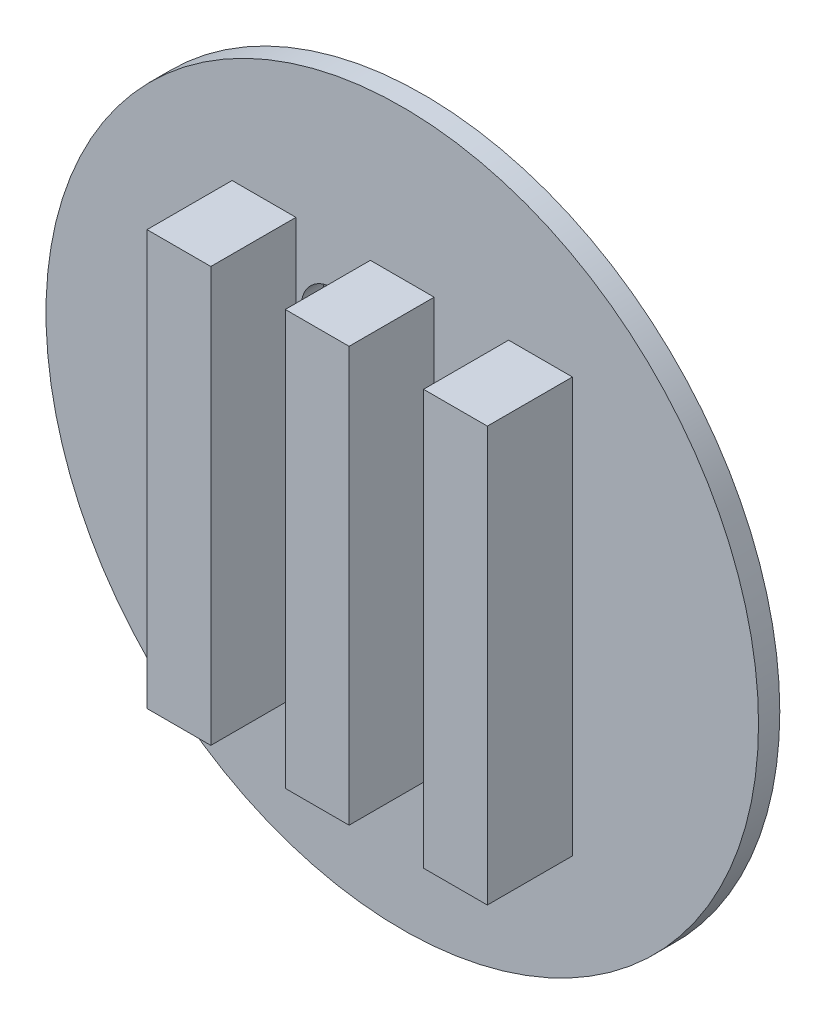
ISO-10303-21;
HEADER;
FILE_DESCRIPTION(('STEP AP214'),'2;1');
FILE_NAME('part.step','',(''),(''),'','','');
FILE_SCHEMA(('AUTOMOTIVE_DESIGN { 1 0 10303 214 1 1 1 1 }'));
ENDSEC;
DATA;
#1=APPLICATION_CONTEXT('core data for automotive mechanical design processes');
#2=APPLICATION_PROTOCOL_DEFINITION('international standard','automotive_design',2000,#1);
#3=PRODUCT_CONTEXT('',#1,'mechanical');
#4=PRODUCT('Part','Part','',(#3));
#5=PRODUCT_RELATED_PRODUCT_CATEGORY('part','',(#4));
#6=PRODUCT_DEFINITION_FORMATION('','',#4);
#7=PRODUCT_DEFINITION_CONTEXT('part definition',#1,'design');
#8=PRODUCT_DEFINITION('design','',#6,#7);
#9=PRODUCT_DEFINITION_SHAPE('','',#8);
#10=(LENGTH_UNIT() NAMED_UNIT(*) SI_UNIT(.MILLI.,.METRE.));
#11=(NAMED_UNIT(*) PLANE_ANGLE_UNIT() SI_UNIT($,.RADIAN.));
#12=(NAMED_UNIT(*) SI_UNIT($,.STERADIAN.) SOLID_ANGLE_UNIT());
#13=UNCERTAINTY_MEASURE_WITH_UNIT(LENGTH_MEASURE(1.E-05),#10,'distance_accuracy_value','');
#14=(GEOMETRIC_REPRESENTATION_CONTEXT(3) GLOBAL_UNCERTAINTY_ASSIGNED_CONTEXT((#13)) GLOBAL_UNIT_ASSIGNED_CONTEXT((#10,
#11,#12)) REPRESENTATION_CONTEXT('',''));
#15=CARTESIAN_POINT('',(0.,0.,0.));
#16=DIRECTION('',(0.,0.,1.));
#17=DIRECTION('',(1.,0.,0.));
#18=AXIS2_PLACEMENT_3D('',#15,#16,#17);
#19=CARTESIAN_POINT('',(0.,0.,1.));
#20=DIRECTION('',(0.,0.,1.));
#21=DIRECTION('',(1.,0.,0.));
#22=AXIS2_PLACEMENT_3D('',#19,#20,#21);
#23=PLANE('',#22);
#24=CARTESIAN_POINT('',(-3.25,6.25,1.));
#25=DIRECTION('',(0.,0.,1.));
#26=DIRECTION('',(1.,0.,0.));
#27=AXIS2_PLACEMENT_3D('',#24,#25,#26);
#28=CIRCLE('',#27,1.5);
#29=CARTESIAN_POINT('',(-1.75,6.25,1.));
#30=VERTEX_POINT('',#29);
#31=EDGE_CURVE('E212',#30,#30,#28,.F.);
#32=ORIENTED_EDGE('',*,*,#31,.T.);
#33=EDGE_LOOP('',(#32));
#34=FACE_BOUND('',#33,.T.);
#35=DIRECTION('',(0.,-1.,0.));
#36=VECTOR('',#35,1.);
#37=CARTESIAN_POINT('',(5.,9.75,1.));
#38=LINE('',#37,#36);
#39=CARTESIAN_POINT('',(5.,9.75,1.));
#40=VERTEX_POINT('',#39);
#41=CARTESIAN_POINT('',(5.,-9.75,1.));
#42=VERTEX_POINT('',#41);
#43=EDGE_CURVE('E329',#40,#42,#38,.T.);
#44=ORIENTED_EDGE('',*,*,#43,.F.);
#45=DIRECTION('',(-1.,0.,0.));
#46=VECTOR('',#45,1.);
#47=CARTESIAN_POINT('',(5.,9.75,1.));
#48=LINE('',#47,#46);
#49=CARTESIAN_POINT('',(8.,9.75,1.));
#50=VERTEX_POINT('',#49);
#51=EDGE_CURVE('E326',#50,#40,#48,.T.);
#52=ORIENTED_EDGE('',*,*,#51,.F.);
#53=DIRECTION('',(0.,1.,0.));
#54=VECTOR('',#53,1.);
#55=CARTESIAN_POINT('',(8.,9.75,1.));
#56=LINE('',#55,#54);
#57=CARTESIAN_POINT('',(8.,-9.75,1.));
#58=VERTEX_POINT('',#57);
#59=EDGE_CURVE('E334',#58,#50,#56,.T.);
#60=ORIENTED_EDGE('',*,*,#59,.F.);
#61=DIRECTION('',(1.,0.,0.));
#62=VECTOR('',#61,1.);
#63=CARTESIAN_POINT('',(5.,-9.75,1.));
#64=LINE('',#63,#62);
#65=EDGE_CURVE('E331',#42,#58,#64,.T.);
#66=ORIENTED_EDGE('',*,*,#65,.F.);
#67=EDGE_LOOP('',(#44,#52,#60,#66));
#68=FACE_BOUND('',#67,.T.);
#69=CARTESIAN_POINT('',(0.,0.,1.));
#70=DIRECTION('',(0.,0.,1.));
#71=DIRECTION('',(1.,0.,0.));
#72=AXIS2_PLACEMENT_3D('',#69,#70,#71);
#73=CIRCLE('',#72,16.75);
#74=CARTESIAN_POINT('',(16.75,0.,1.));
#75=VERTEX_POINT('',#74);
#76=EDGE_CURVE('E11',#75,#75,#73,.T.);
#77=ORIENTED_EDGE('',*,*,#76,.T.);
#78=EDGE_LOOP('',(#77));
#79=FACE_BOUND('',#78,.T.);
#80=DIRECTION('',(1.,0.,0.));
#81=VECTOR('',#80,1.);
#82=CARTESIAN_POINT('',(-1.5,-9.75,1.));
#83=LINE('',#82,#81);
#84=CARTESIAN_POINT('',(-1.5,-9.75,1.));
#85=VERTEX_POINT('',#84);
#86=CARTESIAN_POINT('',(1.5,-9.75,1.));
#87=VERTEX_POINT('',#86);
#88=EDGE_CURVE('E358',#85,#87,#83,.T.);
#89=ORIENTED_EDGE('',*,*,#88,.F.);
#90=DIRECTION('',(0.,-1.,0.));
#91=VECTOR('',#90,1.);
#92=CARTESIAN_POINT('',(-1.5,9.75,1.));
#93=LINE('',#92,#91);
#94=CARTESIAN_POINT('',(-1.5,9.75,1.));
#95=VERTEX_POINT('',#94);
#96=EDGE_CURVE('E355',#95,#85,#93,.T.);
#97=ORIENTED_EDGE('',*,*,#96,.F.);
#98=DIRECTION('',(-1.,0.,0.));
#99=VECTOR('',#98,1.);
#100=CARTESIAN_POINT('',(-1.5,9.75,1.));
#101=LINE('',#100,#99);
#102=CARTESIAN_POINT('',(1.5,9.75,1.));
#103=VERTEX_POINT('',#102);
#104=EDGE_CURVE('E363',#103,#95,#101,.T.);
#105=ORIENTED_EDGE('',*,*,#104,.F.);
#106=DIRECTION('',(0.,1.,0.));
#107=VECTOR('',#106,1.);
#108=CARTESIAN_POINT('',(1.5,9.75,1.));
#109=LINE('',#108,#107);
#110=EDGE_CURVE('E360',#87,#103,#109,.T.);
#111=ORIENTED_EDGE('',*,*,#110,.F.);
#112=EDGE_LOOP('',(#89,#97,#105,#111));
#113=FACE_BOUND('',#112,.T.);
#114=DIRECTION('',(0.,-1.,0.));
#115=VECTOR('',#114,1.);
#116=CARTESIAN_POINT('',(-8.,9.74999999999996,1.));
#117=LINE('',#116,#115);
#118=CARTESIAN_POINT('',(-8.,9.74999999999996,1.));
#119=VERTEX_POINT('',#118);
#120=CARTESIAN_POINT('',(-8.,-9.75000000000004,1.));
#121=VERTEX_POINT('',#120);
#122=EDGE_CURVE('E300',#119,#121,#117,.T.);
#123=ORIENTED_EDGE('',*,*,#122,.F.);
#124=DIRECTION('',(-1.,0.,0.));
#125=VECTOR('',#124,1.);
#126=CARTESIAN_POINT('',(-8.,9.74999999999996,1.));
#127=LINE('',#126,#125);
#128=CARTESIAN_POINT('',(-5.,9.74999999999996,1.));
#129=VERTEX_POINT('',#128);
#130=EDGE_CURVE('E291',#129,#119,#127,.T.);
#131=ORIENTED_EDGE('',*,*,#130,.F.);
#132=DIRECTION('',(0.,1.,0.));
#133=VECTOR('',#132,1.);
#134=CARTESIAN_POINT('',(-5.,9.74999999999996,1.));
#135=LINE('',#134,#133);
#136=CARTESIAN_POINT('',(-5.,-9.75000000000004,1.));
#137=VERTEX_POINT('',#136);
#138=EDGE_CURVE('E305',#137,#129,#135,.T.);
#139=ORIENTED_EDGE('',*,*,#138,.F.);
#140=DIRECTION('',(1.,0.,0.));
#141=VECTOR('',#140,1.);
#142=CARTESIAN_POINT('',(-8.,-9.75000000000004,1.));
#143=LINE('',#142,#141);
#144=EDGE_CURVE('E302',#121,#137,#143,.T.);
#145=ORIENTED_EDGE('',*,*,#144,.F.);
#146=EDGE_LOOP('',(#123,#131,#139,#145));
#147=FACE_BOUND('',#146,.T.);
#148=CARTESIAN_POINT('',(3.25,-6.26239385569364,1.));
#149=DIRECTION('',(0.,0.,1.));
#150=DIRECTION('',(1.,0.,0.));
#151=AXIS2_PLACEMENT_3D('',#148,#149,#150);
#152=CIRCLE('',#151,1.5);
#153=CARTESIAN_POINT('',(4.75,-6.26239385569364,1.));
#154=VERTEX_POINT('',#153);
#155=EDGE_CURVE('E395',#154,#154,#152,.F.);
#156=ORIENTED_EDGE('',*,*,#155,.T.);
#157=EDGE_LOOP('',(#156));
#158=FACE_BOUND('',#157,.T.);
#159=ADVANCED_FACE('F28',(#34,#68,#79,#113,#147,#158),#23,.T.);
#160=CARTESIAN_POINT('',(0.,0.,0.));
#161=DIRECTION('',(0.,0.,1.));
#162=DIRECTION('',(1.,0.,0.));
#163=AXIS2_PLACEMENT_3D('',#160,#161,#162);
#164=PLANE('',#163);
#165=CARTESIAN_POINT('',(-3.25,6.25,0.));
#166=DIRECTION('',(0.,0.,1.));
#167=DIRECTION('',(1.,0.,0.));
#168=AXIS2_PLACEMENT_3D('',#165,#166,#167);
#169=CIRCLE('',#168,1.5);
#170=CARTESIAN_POINT('',(-1.75,6.25,0.));
#171=VERTEX_POINT('',#170);
#172=EDGE_CURVE('E215',#171,#171,#169,.T.);
#173=ORIENTED_EDGE('',*,*,#172,.T.);
#174=EDGE_LOOP('',(#173));
#175=FACE_BOUND('',#174,.T.);
#176=DIRECTION('',(0.,1.,0.));
#177=VECTOR('',#176,1.);
#178=CARTESIAN_POINT('',(-5.5,-9.75000000000004,0.));
#179=LINE('',#178,#177);
#180=CARTESIAN_POINT('',(-5.5,-9.75000000000004,0.));
#181=VERTEX_POINT('',#180);
#182=CARTESIAN_POINT('',(-5.5,9.74999999999996,0.));
#183=VERTEX_POINT('',#182);
#184=EDGE_CURVE('E211',#181,#183,#179,.T.);
#185=ORIENTED_EDGE('',*,*,#184,.T.);
#186=DIRECTION('',(-1.,0.,0.));
#187=VECTOR('',#186,1.);
#188=CARTESIAN_POINT('',(-5.5,9.74999999999996,0.));
#189=LINE('',#188,#187);
#190=CARTESIAN_POINT('',(-7.5,9.74999999999996,0.));
#191=VERTEX_POINT('',#190);
#192=EDGE_CURVE('E193',#183,#191,#189,.T.);
#193=ORIENTED_EDGE('',*,*,#192,.T.);
#194=DIRECTION('',(0.,-1.,0.));
#195=VECTOR('',#194,1.);
#196=CARTESIAN_POINT('',(-7.5,9.74999999999996,0.));
#197=LINE('',#196,#195);
#198=CARTESIAN_POINT('',(-7.5,-9.75000000000004,0.));
#199=VERTEX_POINT('',#198);
#200=EDGE_CURVE('E204',#191,#199,#197,.T.);
#201=ORIENTED_EDGE('',*,*,#200,.T.);
#202=DIRECTION('',(1.,0.,0.));
#203=VECTOR('',#202,1.);
#204=CARTESIAN_POINT('',(-7.5,-9.75000000000004,0.));
#205=LINE('',#204,#203);
#206=EDGE_CURVE('E43',#199,#181,#205,.T.);
#207=ORIENTED_EDGE('',*,*,#206,.T.);
#208=EDGE_LOOP('',(#185,#193,#201,#207));
#209=FACE_BOUND('',#208,.T.);
#210=DIRECTION('',(0.,1.,0.));
#211=VECTOR('',#210,1.);
#212=CARTESIAN_POINT('',(1.,-9.75,0.));
#213=LINE('',#212,#211);
#214=CARTESIAN_POINT('',(1.,-9.75,0.));
#215=VERTEX_POINT('',#214);
#216=CARTESIAN_POINT('',(1.,9.75,0.));
#217=VERTEX_POINT('',#216);
#218=EDGE_CURVE('E241',#215,#217,#213,.T.);
#219=ORIENTED_EDGE('',*,*,#218,.T.);
#220=DIRECTION('',(-1.,0.,0.));
#221=VECTOR('',#220,1.);
#222=CARTESIAN_POINT('',(1.,9.75,0.));
#223=LINE('',#222,#221);
#224=CARTESIAN_POINT('',(-1.,9.75,0.));
#225=VERTEX_POINT('',#224);
#226=EDGE_CURVE('E231',#217,#225,#223,.T.);
#227=ORIENTED_EDGE('',*,*,#226,.T.);
#228=DIRECTION('',(0.,-1.,0.));
#229=VECTOR('',#228,1.);
#230=CARTESIAN_POINT('',(-1.,9.75,0.));
#231=LINE('',#230,#229);
#232=CARTESIAN_POINT('',(-1.,-9.75,0.));
#233=VERTEX_POINT('',#232);
#234=EDGE_CURVE('E237',#225,#233,#231,.T.);
#235=ORIENTED_EDGE('',*,*,#234,.T.);
#236=DIRECTION('',(1.,0.,0.));
#237=VECTOR('',#236,1.);
#238=CARTESIAN_POINT('',(-1.,-9.75,0.));
#239=LINE('',#238,#237);
#240=EDGE_CURVE('E51',#233,#215,#239,.T.);
#241=ORIENTED_EDGE('',*,*,#240,.T.);
#242=EDGE_LOOP('',(#219,#227,#235,#241));
#243=FACE_BOUND('',#242,.T.);
#244=DIRECTION('',(0.,1.,0.));
#245=VECTOR('',#244,1.);
#246=CARTESIAN_POINT('',(7.5,-9.75,0.));
#247=LINE('',#246,#245);
#248=CARTESIAN_POINT('',(7.5,-9.75,0.));
#249=VERTEX_POINT('',#248);
#250=CARTESIAN_POINT('',(7.5,9.75,0.));
#251=VERTEX_POINT('',#250);
#252=EDGE_CURVE('E273',#249,#251,#247,.T.);
#253=ORIENTED_EDGE('',*,*,#252,.T.);
#254=DIRECTION('',(-1.,0.,0.));
#255=VECTOR('',#254,1.);
#256=CARTESIAN_POINT('',(7.5,9.75,0.));
#257=LINE('',#256,#255);
#258=CARTESIAN_POINT('',(5.5,9.75,0.));
#259=VERTEX_POINT('',#258);
#260=EDGE_CURVE('E259',#251,#259,#257,.T.);
#261=ORIENTED_EDGE('',*,*,#260,.T.);
#262=DIRECTION('',(0.,-1.,0.));
#263=VECTOR('',#262,1.);
#264=CARTESIAN_POINT('',(5.5,9.75,0.));
#265=LINE('',#264,#263);
#266=CARTESIAN_POINT('',(5.5,-9.75,0.));
#267=VERTEX_POINT('',#266);
#268=EDGE_CURVE('E267',#259,#267,#265,.T.);
#269=ORIENTED_EDGE('',*,*,#268,.T.);
#270=DIRECTION('',(1.,0.,0.));
#271=VECTOR('',#270,1.);
#272=CARTESIAN_POINT('',(5.5,-9.75,0.));
#273=LINE('',#272,#271);
#274=EDGE_CURVE('E270',#267,#249,#273,.T.);
#275=ORIENTED_EDGE('',*,*,#274,.T.);
#276=EDGE_LOOP('',(#253,#261,#269,#275));
#277=FACE_BOUND('',#276,.T.);
#278=CARTESIAN_POINT('',(0.,0.,0.));
#279=DIRECTION('',(0.,0.,1.));
#280=DIRECTION('',(1.,0.,0.));
#281=AXIS2_PLACEMENT_3D('',#278,#279,#280);
#282=CIRCLE('',#281,16.75);
#283=CARTESIAN_POINT('',(16.75,0.,0.));
#284=VERTEX_POINT('',#283);
#285=EDGE_CURVE('E36',#284,#284,#282,.T.);
#286=ORIENTED_EDGE('',*,*,#285,.F.);
#287=EDGE_LOOP('',(#286));
#288=FACE_BOUND('',#287,.T.);
#289=CARTESIAN_POINT('',(3.25,-6.26239385569364,0.));
#290=DIRECTION('',(0.,0.,1.));
#291=DIRECTION('',(1.,0.,0.));
#292=AXIS2_PLACEMENT_3D('',#289,#290,#291);
#293=CIRCLE('',#292,1.5);
#294=CARTESIAN_POINT('',(4.75,-6.26239385569364,0.));
#295=VERTEX_POINT('',#294);
#296=EDGE_CURVE('E393',#295,#295,#293,.T.);
#297=ORIENTED_EDGE('',*,*,#296,.T.);
#298=EDGE_LOOP('',(#297));
#299=FACE_BOUND('',#298,.T.);
#300=ADVANCED_FACE('F208',(#175,#209,#243,#277,#288,#299),#164,.F.);
#301=CARTESIAN_POINT('',(0.,0.,1.));
#302=DIRECTION('',(0.,0.,-1.));
#303=DIRECTION('',(-1.,0.,0.));
#304=AXIS2_PLACEMENT_3D('',#301,#302,#303);
#305=CYLINDRICAL_SURFACE('',#304,16.75);
#306=ORIENTED_EDGE('',*,*,#76,.F.);
#307=EDGE_LOOP('',(#306));
#308=FACE_BOUND('',#307,.T.);
#309=ORIENTED_EDGE('',*,*,#285,.T.);
#310=EDGE_LOOP('',(#309));
#311=FACE_BOUND('',#310,.T.);
#312=ADVANCED_FACE('F30',(#308,#311),#305,.T.);
#313=CARTESIAN_POINT('',(-1.5,9.75,5.));
#314=DIRECTION('',(1.,0.,0.));
#315=DIRECTION('',(0.,1.,0.));
#316=AXIS2_PLACEMENT_3D('',#313,#314,#315);
#317=PLANE('',#316);
#318=ORIENTED_EDGE('',*,*,#96,.T.);
#319=DIRECTION('',(0.,0.,-1.));
#320=VECTOR('',#319,1.);
#321=CARTESIAN_POINT('',(-1.5,-9.75,5.));
#322=LINE('',#321,#320);
#323=CARTESIAN_POINT('',(-1.5,-9.75,5.));
#324=VERTEX_POINT('',#323);
#325=EDGE_CURVE('E382',#324,#85,#322,.T.);
#326=ORIENTED_EDGE('',*,*,#325,.F.);
#327=DIRECTION('',(0.,-1.,0.));
#328=VECTOR('',#327,1.);
#329=CARTESIAN_POINT('',(-1.5,9.75,5.));
#330=LINE('',#329,#328);
#331=CARTESIAN_POINT('',(-1.5,9.75,5.));
#332=VERTEX_POINT('',#331);
#333=EDGE_CURVE('E365',#332,#324,#330,.T.);
#334=ORIENTED_EDGE('',*,*,#333,.F.);
#335=DIRECTION('',(0.,0.,-1.));
#336=VECTOR('',#335,1.);
#337=CARTESIAN_POINT('',(-1.5,9.75,5.));
#338=LINE('',#337,#336);
#339=EDGE_CURVE('E374',#332,#95,#338,.T.);
#340=ORIENTED_EDGE('',*,*,#339,.T.);
#341=EDGE_LOOP('',(#318,#326,#334,#340));
#342=FACE_BOUND('',#341,.T.);
#343=ADVANCED_FACE('F423',(#342),#317,.F.);
#344=CARTESIAN_POINT('',(-1.5,-9.75,5.));
#345=DIRECTION('',(0.,1.,0.));
#346=DIRECTION('',(0.,0.,1.));
#347=AXIS2_PLACEMENT_3D('',#344,#345,#346);
#348=PLANE('',#347);
#349=ORIENTED_EDGE('',*,*,#88,.T.);
#350=DIRECTION('',(0.,0.,-1.));
#351=VECTOR('',#350,1.);
#352=CARTESIAN_POINT('',(1.5,-9.75,5.));
#353=LINE('',#352,#351);
#354=CARTESIAN_POINT('',(1.5,-9.75,5.));
#355=VERTEX_POINT('',#354);
#356=EDGE_CURVE('E379',#355,#87,#353,.T.);
#357=ORIENTED_EDGE('',*,*,#356,.F.);
#358=DIRECTION('',(1.,0.,0.));
#359=VECTOR('',#358,1.);
#360=CARTESIAN_POINT('',(-1.5,-9.75,5.));
#361=LINE('',#360,#359);
#362=EDGE_CURVE('E368',#324,#355,#361,.T.);
#363=ORIENTED_EDGE('',*,*,#362,.F.);
#364=ORIENTED_EDGE('',*,*,#325,.T.);
#365=EDGE_LOOP('',(#349,#357,#363,#364));
#366=FACE_BOUND('',#365,.T.);
#367=ADVANCED_FACE('F426',(#366),#348,.F.);
#368=CARTESIAN_POINT('',(1.5,9.75,5.));
#369=DIRECTION('',(-1.,0.,0.));
#370=DIRECTION('',(0.,-1.,0.));
#371=AXIS2_PLACEMENT_3D('',#368,#369,#370);
#372=PLANE('',#371);
#373=ORIENTED_EDGE('',*,*,#110,.T.);
#374=DIRECTION('',(0.,0.,-1.));
#375=VECTOR('',#374,1.);
#376=CARTESIAN_POINT('',(1.5,9.75,5.));
#377=LINE('',#376,#375);
#378=CARTESIAN_POINT('',(1.5,9.75,5.));
#379=VERTEX_POINT('',#378);
#380=EDGE_CURVE('E377',#379,#103,#377,.T.);
#381=ORIENTED_EDGE('',*,*,#380,.F.);
#382=DIRECTION('',(0.,1.,0.));
#383=VECTOR('',#382,1.);
#384=CARTESIAN_POINT('',(1.5,9.75,5.));
#385=LINE('',#384,#383);
#386=EDGE_CURVE('E370',#355,#379,#385,.T.);
#387=ORIENTED_EDGE('',*,*,#386,.F.);
#388=ORIENTED_EDGE('',*,*,#356,.T.);
#389=EDGE_LOOP('',(#373,#381,#387,#388));
#390=FACE_BOUND('',#389,.T.);
#391=ADVANCED_FACE('F430',(#390),#372,.F.);
#392=CARTESIAN_POINT('',(-1.5,9.75,5.));
#393=DIRECTION('',(0.,-1.,0.));
#394=DIRECTION('',(1.,0.,0.));
#395=AXIS2_PLACEMENT_3D('',#392,#393,#394);
#396=PLANE('',#395);
#397=ORIENTED_EDGE('',*,*,#104,.T.);
#398=ORIENTED_EDGE('',*,*,#339,.F.);
#399=DIRECTION('',(-1.,0.,0.));
#400=VECTOR('',#399,1.);
#401=CARTESIAN_POINT('',(-1.5,9.75,5.));
#402=LINE('',#401,#400);
#403=EDGE_CURVE('E372',#379,#332,#402,.T.);
#404=ORIENTED_EDGE('',*,*,#403,.F.);
#405=ORIENTED_EDGE('',*,*,#380,.T.);
#406=EDGE_LOOP('',(#397,#398,#404,#405));
#407=FACE_BOUND('',#406,.T.);
#408=ADVANCED_FACE('F434',(#407),#396,.F.);
#409=CARTESIAN_POINT('',(-1.5,-9.75,5.));
#410=DIRECTION('',(0.,0.,1.));
#411=DIRECTION('',(1.,0.,0.));
#412=AXIS2_PLACEMENT_3D('',#409,#410,#411);
#413=PLANE('',#412);
#414=ORIENTED_EDGE('',*,*,#333,.T.);
#415=ORIENTED_EDGE('',*,*,#362,.T.);
#416=ORIENTED_EDGE('',*,*,#386,.T.);
#417=ORIENTED_EDGE('',*,*,#403,.T.);
#418=EDGE_LOOP('',(#414,#415,#416,#417));
#419=FACE_BOUND('',#418,.T.);
#420=ADVANCED_FACE('F438',(#419),#413,.T.);
#421=CARTESIAN_POINT('',(5.,9.75,5.));
#422=DIRECTION('',(0.,-1.,0.));
#423=DIRECTION('',(1.,0.,0.));
#424=AXIS2_PLACEMENT_3D('',#421,#422,#423);
#425=PLANE('',#424);
#426=ORIENTED_EDGE('',*,*,#51,.T.);
#427=DIRECTION('',(0.,0.,-1.));
#428=VECTOR('',#427,1.);
#429=CARTESIAN_POINT('',(5.,9.75,5.));
#430=LINE('',#429,#428);
#431=CARTESIAN_POINT('',(5.,9.75,5.));
#432=VERTEX_POINT('',#431);
#433=EDGE_CURVE('E353',#432,#40,#430,.T.);
#434=ORIENTED_EDGE('',*,*,#433,.F.);
#435=DIRECTION('',(-1.,0.,0.));
#436=VECTOR('',#435,1.);
#437=CARTESIAN_POINT('',(5.,9.75,5.));
#438=LINE('',#437,#436);
#439=CARTESIAN_POINT('',(8.,9.75,5.));
#440=VERTEX_POINT('',#439);
#441=EDGE_CURVE('E336',#440,#432,#438,.T.);
#442=ORIENTED_EDGE('',*,*,#441,.F.);
#443=DIRECTION('',(0.,0.,-1.));
#444=VECTOR('',#443,1.);
#445=CARTESIAN_POINT('',(8.,9.75,5.));
#446=LINE('',#445,#444);
#447=EDGE_CURVE('E345',#440,#50,#446,.T.);
#448=ORIENTED_EDGE('',*,*,#447,.T.);
#449=EDGE_LOOP('',(#426,#434,#442,#448));
#450=FACE_BOUND('',#449,.T.);
#451=ADVANCED_FACE('F442',(#450),#425,.F.);
#452=CARTESIAN_POINT('',(5.,9.75,5.));
#453=DIRECTION('',(1.,0.,0.));
#454=DIRECTION('',(0.,1.,0.));
#455=AXIS2_PLACEMENT_3D('',#452,#453,#454);
#456=PLANE('',#455);
#457=ORIENTED_EDGE('',*,*,#43,.T.);
#458=DIRECTION('',(0.,0.,-1.));
#459=VECTOR('',#458,1.);
#460=CARTESIAN_POINT('',(5.,-9.75,5.));
#461=LINE('',#460,#459);
#462=CARTESIAN_POINT('',(5.,-9.75,5.));
#463=VERTEX_POINT('',#462);
#464=EDGE_CURVE('E350',#463,#42,#461,.T.);
#465=ORIENTED_EDGE('',*,*,#464,.F.);
#466=DIRECTION('',(0.,-1.,0.));
#467=VECTOR('',#466,1.);
#468=CARTESIAN_POINT('',(5.,9.75,5.));
#469=LINE('',#468,#467);
#470=EDGE_CURVE('E339',#432,#463,#469,.T.);
#471=ORIENTED_EDGE('',*,*,#470,.F.);
#472=ORIENTED_EDGE('',*,*,#433,.T.);
#473=EDGE_LOOP('',(#457,#465,#471,#472));
#474=FACE_BOUND('',#473,.T.);
#475=ADVANCED_FACE('F446',(#474),#456,.F.);
#476=CARTESIAN_POINT('',(5.,-9.75,5.));
#477=DIRECTION('',(0.,1.,0.));
#478=DIRECTION('',(0.,0.,1.));
#479=AXIS2_PLACEMENT_3D('',#476,#477,#478);
#480=PLANE('',#479);
#481=ORIENTED_EDGE('',*,*,#65,.T.);
#482=DIRECTION('',(0.,0.,-1.));
#483=VECTOR('',#482,1.);
#484=CARTESIAN_POINT('',(8.,-9.75,5.));
#485=LINE('',#484,#483);
#486=CARTESIAN_POINT('',(8.,-9.75,5.));
#487=VERTEX_POINT('',#486);
#488=EDGE_CURVE('E348',#487,#58,#485,.T.);
#489=ORIENTED_EDGE('',*,*,#488,.F.);
#490=DIRECTION('',(1.,0.,0.));
#491=VECTOR('',#490,1.);
#492=CARTESIAN_POINT('',(5.,-9.75,5.));
#493=LINE('',#492,#491);
#494=EDGE_CURVE('E341',#463,#487,#493,.T.);
#495=ORIENTED_EDGE('',*,*,#494,.F.);
#496=ORIENTED_EDGE('',*,*,#464,.T.);
#497=EDGE_LOOP('',(#481,#489,#495,#496));
#498=FACE_BOUND('',#497,.T.);
#499=ADVANCED_FACE('F450',(#498),#480,.F.);
#500=CARTESIAN_POINT('',(8.,9.75,5.));
#501=DIRECTION('',(-1.,0.,0.));
#502=DIRECTION('',(0.,-1.,0.));
#503=AXIS2_PLACEMENT_3D('',#500,#501,#502);
#504=PLANE('',#503);
#505=ORIENTED_EDGE('',*,*,#59,.T.);
#506=ORIENTED_EDGE('',*,*,#447,.F.);
#507=DIRECTION('',(0.,1.,0.));
#508=VECTOR('',#507,1.);
#509=CARTESIAN_POINT('',(8.,9.75,5.));
#510=LINE('',#509,#508);
#511=EDGE_CURVE('E343',#487,#440,#510,.T.);
#512=ORIENTED_EDGE('',*,*,#511,.F.);
#513=ORIENTED_EDGE('',*,*,#488,.T.);
#514=EDGE_LOOP('',(#505,#506,#512,#513));
#515=FACE_BOUND('',#514,.T.);
#516=ADVANCED_FACE('F454',(#515),#504,.F.);
#517=CARTESIAN_POINT('',(8.,9.75,5.));
#518=DIRECTION('',(0.,0.,-1.));
#519=DIRECTION('',(-1.,0.,0.));
#520=AXIS2_PLACEMENT_3D('',#517,#518,#519);
#521=PLANE('',#520);
#522=ORIENTED_EDGE('',*,*,#441,.T.);
#523=ORIENTED_EDGE('',*,*,#470,.T.);
#524=ORIENTED_EDGE('',*,*,#494,.T.);
#525=ORIENTED_EDGE('',*,*,#511,.T.);
#526=EDGE_LOOP('',(#522,#523,#524,#525));
#527=FACE_BOUND('',#526,.T.);
#528=ADVANCED_FACE('F458',(#527),#521,.F.);
#529=CARTESIAN_POINT('',(-8.,9.74999999999996,5.));
#530=DIRECTION('',(0.,-1.,0.));
#531=DIRECTION('',(1.,0.,0.));
#532=AXIS2_PLACEMENT_3D('',#529,#530,#531);
#533=PLANE('',#532);
#534=ORIENTED_EDGE('',*,*,#130,.T.);
#535=DIRECTION('',(0.,0.,-1.));
#536=VECTOR('',#535,1.);
#537=CARTESIAN_POINT('',(-8.,9.74999999999996,5.));
#538=LINE('',#537,#536);
#539=CARTESIAN_POINT('',(-8.,9.74999999999996,5.));
#540=VERTEX_POINT('',#539);
#541=EDGE_CURVE('E324',#540,#119,#538,.T.);
#542=ORIENTED_EDGE('',*,*,#541,.F.);
#543=DIRECTION('',(-1.,0.,0.));
#544=VECTOR('',#543,1.);
#545=CARTESIAN_POINT('',(-8.,9.74999999999996,5.));
#546=LINE('',#545,#544);
#547=CARTESIAN_POINT('',(-5.,9.74999999999996,5.));
#548=VERTEX_POINT('',#547);
#549=EDGE_CURVE('E307',#548,#540,#546,.T.);
#550=ORIENTED_EDGE('',*,*,#549,.F.);
#551=DIRECTION('',(0.,0.,-1.));
#552=VECTOR('',#551,1.);
#553=CARTESIAN_POINT('',(-5.,9.74999999999996,5.));
#554=LINE('',#553,#552);
#555=EDGE_CURVE('E316',#548,#129,#554,.T.);
#556=ORIENTED_EDGE('',*,*,#555,.T.);
#557=EDGE_LOOP('',(#534,#542,#550,#556));
#558=FACE_BOUND('',#557,.T.);
#559=ADVANCED_FACE('F462',(#558),#533,.F.);
#560=CARTESIAN_POINT('',(-8.,9.74999999999996,5.));
#561=DIRECTION('',(1.,0.,0.));
#562=DIRECTION('',(0.,1.,0.));
#563=AXIS2_PLACEMENT_3D('',#560,#561,#562);
#564=PLANE('',#563);
#565=ORIENTED_EDGE('',*,*,#122,.T.);
#566=DIRECTION('',(0.,0.,-1.));
#567=VECTOR('',#566,1.);
#568=CARTESIAN_POINT('',(-8.,-9.75000000000004,5.));
#569=LINE('',#568,#567);
#570=CARTESIAN_POINT('',(-8.,-9.75000000000004,5.));
#571=VERTEX_POINT('',#570);
#572=EDGE_CURVE('E321',#571,#121,#569,.T.);
#573=ORIENTED_EDGE('',*,*,#572,.F.);
#574=DIRECTION('',(0.,-1.,0.));
#575=VECTOR('',#574,1.);
#576=CARTESIAN_POINT('',(-8.,9.74999999999996,5.));
#577=LINE('',#576,#575);
#578=EDGE_CURVE('E310',#540,#571,#577,.T.);
#579=ORIENTED_EDGE('',*,*,#578,.F.);
#580=ORIENTED_EDGE('',*,*,#541,.T.);
#581=EDGE_LOOP('',(#565,#573,#579,#580));
#582=FACE_BOUND('',#581,.T.);
#583=ADVANCED_FACE('F466',(#582),#564,.F.);
#584=CARTESIAN_POINT('',(-8.,-9.75000000000004,5.));
#585=DIRECTION('',(0.,1.,0.));
#586=DIRECTION('',(0.,0.,1.));
#587=AXIS2_PLACEMENT_3D('',#584,#585,#586);
#588=PLANE('',#587);
#589=ORIENTED_EDGE('',*,*,#144,.T.);
#590=DIRECTION('',(0.,0.,-1.));
#591=VECTOR('',#590,1.);
#592=CARTESIAN_POINT('',(-5.,-9.75000000000004,5.));
#593=LINE('',#592,#591);
#594=CARTESIAN_POINT('',(-5.,-9.75000000000004,5.));
#595=VERTEX_POINT('',#594);
#596=EDGE_CURVE('E319',#595,#137,#593,.T.);
#597=ORIENTED_EDGE('',*,*,#596,.F.);
#598=DIRECTION('',(1.,0.,0.));
#599=VECTOR('',#598,1.);
#600=CARTESIAN_POINT('',(-8.,-9.75000000000004,5.));
#601=LINE('',#600,#599);
#602=EDGE_CURVE('E312',#571,#595,#601,.T.);
#603=ORIENTED_EDGE('',*,*,#602,.F.);
#604=ORIENTED_EDGE('',*,*,#572,.T.);
#605=EDGE_LOOP('',(#589,#597,#603,#604));
#606=FACE_BOUND('',#605,.T.);
#607=ADVANCED_FACE('F470',(#606),#588,.F.);
#608=CARTESIAN_POINT('',(-5.,9.74999999999996,5.));
#609=DIRECTION('',(-1.,0.,0.));
#610=DIRECTION('',(0.,-1.,0.));
#611=AXIS2_PLACEMENT_3D('',#608,#609,#610);
#612=PLANE('',#611);
#613=ORIENTED_EDGE('',*,*,#138,.T.);
#614=ORIENTED_EDGE('',*,*,#555,.F.);
#615=DIRECTION('',(0.,1.,0.));
#616=VECTOR('',#615,1.);
#617=CARTESIAN_POINT('',(-5.,9.74999999999996,5.));
#618=LINE('',#617,#616);
#619=EDGE_CURVE('E314',#595,#548,#618,.T.);
#620=ORIENTED_EDGE('',*,*,#619,.F.);
#621=ORIENTED_EDGE('',*,*,#596,.T.);
#622=EDGE_LOOP('',(#613,#614,#620,#621));
#623=FACE_BOUND('',#622,.T.);
#624=ADVANCED_FACE('F474',(#623),#612,.F.);
#625=CARTESIAN_POINT('',(-8.,9.74999999999996,5.));
#626=DIRECTION('',(0.,0.,-1.));
#627=DIRECTION('',(-1.,0.,0.));
#628=AXIS2_PLACEMENT_3D('',#625,#626,#627);
#629=PLANE('',#628);
#630=ORIENTED_EDGE('',*,*,#549,.T.);
#631=ORIENTED_EDGE('',*,*,#578,.T.);
#632=ORIENTED_EDGE('',*,*,#602,.T.);
#633=ORIENTED_EDGE('',*,*,#619,.T.);
#634=EDGE_LOOP('',(#630,#631,#632,#633));
#635=FACE_BOUND('',#634,.T.);
#636=ADVANCED_FACE('F478',(#635),#629,.F.);
#637=CARTESIAN_POINT('',(7.5,9.75,-2.));
#638=DIRECTION('',(0.,1.,0.));
#639=DIRECTION('',(-1.,0.,0.));
#640=AXIS2_PLACEMENT_3D('',#637,#638,#639);
#641=PLANE('',#640);
#642=ORIENTED_EDGE('',*,*,#260,.F.);
#643=DIRECTION('',(0.,0.,1.));
#644=VECTOR('',#643,1.);
#645=CARTESIAN_POINT('',(7.5,9.75,-2.));
#646=LINE('',#645,#644);
#647=CARTESIAN_POINT('',(7.5,9.75,-2.));
#648=VERTEX_POINT('',#647);
#649=EDGE_CURVE('E289',#648,#251,#646,.T.);
#650=ORIENTED_EDGE('',*,*,#649,.F.);
#651=DIRECTION('',(-1.,0.,0.));
#652=VECTOR('',#651,1.);
#653=CARTESIAN_POINT('',(7.5,9.75,-2.));
#654=LINE('',#653,#652);
#655=CARTESIAN_POINT('',(5.5,9.75,-2.));
#656=VERTEX_POINT('',#655);
#657=EDGE_CURVE('E276',#648,#656,#654,.T.);
#658=ORIENTED_EDGE('',*,*,#657,.T.);
#659=DIRECTION('',(0.,0.,1.));
#660=VECTOR('',#659,1.);
#661=CARTESIAN_POINT('',(5.5,9.75,-2.));
#662=LINE('',#661,#660);
#663=EDGE_CURVE('E288',#656,#259,#662,.T.);
#664=ORIENTED_EDGE('',*,*,#663,.T.);
#665=EDGE_LOOP('',(#642,#650,#658,#664));
#666=FACE_BOUND('',#665,.T.);
#667=ADVANCED_FACE('F482',(#666),#641,.T.);
#668=CARTESIAN_POINT('',(7.5,-9.75,-2.));
#669=DIRECTION('',(1.,0.,0.));
#670=DIRECTION('',(0.,1.,0.));
#671=AXIS2_PLACEMENT_3D('',#668,#669,#670);
#672=PLANE('',#671);
#673=ORIENTED_EDGE('',*,*,#252,.F.);
#674=DIRECTION('',(0.,0.,1.));
#675=VECTOR('',#674,1.);
#676=CARTESIAN_POINT('',(7.5,-9.75,-2.));
#677=LINE('',#676,#675);
#678=CARTESIAN_POINT('',(7.5,-9.75,-2.));
#679=VERTEX_POINT('',#678);
#680=EDGE_CURVE('E292',#679,#249,#677,.T.);
#681=ORIENTED_EDGE('',*,*,#680,.F.);
#682=DIRECTION('',(0.,1.,0.));
#683=VECTOR('',#682,1.);
#684=CARTESIAN_POINT('',(7.5,-9.75,-2.));
#685=LINE('',#684,#683);
#686=EDGE_CURVE('E285',#679,#648,#685,.T.);
#687=ORIENTED_EDGE('',*,*,#686,.T.);
#688=ORIENTED_EDGE('',*,*,#649,.T.);
#689=EDGE_LOOP('',(#673,#681,#687,#688));
#690=FACE_BOUND('',#689,.T.);
#691=ADVANCED_FACE('F486',(#690),#672,.T.);
#692=CARTESIAN_POINT('',(5.5,-9.75,-2.));
#693=DIRECTION('',(0.,-1.,0.));
#694=DIRECTION('',(0.,0.,-1.));
#695=AXIS2_PLACEMENT_3D('',#692,#693,#694);
#696=PLANE('',#695);
#697=ORIENTED_EDGE('',*,*,#274,.F.);
#698=DIRECTION('',(0.,0.,1.));
#699=VECTOR('',#698,1.);
#700=CARTESIAN_POINT('',(5.5,-9.75,-2.));
#701=LINE('',#700,#699);
#702=CARTESIAN_POINT('',(5.5,-9.75,-2.));
#703=VERTEX_POINT('',#702);
#704=EDGE_CURVE('E294',#703,#267,#701,.T.);
#705=ORIENTED_EDGE('',*,*,#704,.F.);
#706=DIRECTION('',(1.,0.,0.));
#707=VECTOR('',#706,1.);
#708=CARTESIAN_POINT('',(5.5,-9.75,-2.));
#709=LINE('',#708,#707);
#710=EDGE_CURVE('E282',#703,#679,#709,.T.);
#711=ORIENTED_EDGE('',*,*,#710,.T.);
#712=ORIENTED_EDGE('',*,*,#680,.T.);
#713=EDGE_LOOP('',(#697,#705,#711,#712));
#714=FACE_BOUND('',#713,.T.);
#715=ADVANCED_FACE('F492',(#714),#696,.T.);
#716=CARTESIAN_POINT('',(5.5,9.75,-2.));
#717=DIRECTION('',(-1.,0.,0.));
#718=DIRECTION('',(0.,0.,1.));
#719=AXIS2_PLACEMENT_3D('',#716,#717,#718);
#720=PLANE('',#719);
#721=ORIENTED_EDGE('',*,*,#268,.F.);
#722=ORIENTED_EDGE('',*,*,#663,.F.);
#723=DIRECTION('',(0.,-1.,0.));
#724=VECTOR('',#723,1.);
#725=CARTESIAN_POINT('',(5.5,9.75,-2.));
#726=LINE('',#725,#724);
#727=EDGE_CURVE('E279',#656,#703,#726,.T.);
#728=ORIENTED_EDGE('',*,*,#727,.T.);
#729=ORIENTED_EDGE('',*,*,#704,.T.);
#730=EDGE_LOOP('',(#721,#722,#728,#729));
#731=FACE_BOUND('',#730,.T.);
#732=ADVANCED_FACE('F488',(#731),#720,.T.);
#733=CARTESIAN_POINT('',(7.5,9.75,-2.));
#734=DIRECTION('',(0.,0.,-1.));
#735=DIRECTION('',(-1.,0.,0.));
#736=AXIS2_PLACEMENT_3D('',#733,#734,#735);
#737=PLANE('',#736);
#738=ORIENTED_EDGE('',*,*,#657,.F.);
#739=ORIENTED_EDGE('',*,*,#686,.F.);
#740=ORIENTED_EDGE('',*,*,#710,.F.);
#741=ORIENTED_EDGE('',*,*,#727,.F.);
#742=EDGE_LOOP('',(#738,#739,#740,#741));
#743=FACE_BOUND('',#742,.T.);
#744=ADVANCED_FACE('F491',(#743),#737,.T.);
#745=CARTESIAN_POINT('',(1.,9.75,-2.));
#746=DIRECTION('',(0.,1.,0.));
#747=DIRECTION('',(-1.,0.,0.));
#748=AXIS2_PLACEMENT_3D('',#745,#746,#747);
#749=PLANE('',#748);
#750=ORIENTED_EDGE('',*,*,#226,.F.);
#751=DIRECTION('',(0.,0.,1.));
#752=VECTOR('',#751,1.);
#753=CARTESIAN_POINT('',(1.,9.75,-2.));
#754=LINE('',#753,#752);
#755=CARTESIAN_POINT('',(1.,9.75,-2.));
#756=VERTEX_POINT('',#755);
#757=EDGE_CURVE('E257',#756,#217,#754,.T.);
#758=ORIENTED_EDGE('',*,*,#757,.F.);
#759=DIRECTION('',(-1.,0.,0.));
#760=VECTOR('',#759,1.);
#761=CARTESIAN_POINT('',(1.,9.75,-2.));
#762=LINE('',#761,#760);
#763=CARTESIAN_POINT('',(-1.,9.75,-2.));
#764=VERTEX_POINT('',#763);
#765=EDGE_CURVE('E244',#756,#764,#762,.T.);
#766=ORIENTED_EDGE('',*,*,#765,.T.);
#767=DIRECTION('',(0.,0.,1.));
#768=VECTOR('',#767,1.);
#769=CARTESIAN_POINT('',(-1.,9.75,-2.));
#770=LINE('',#769,#768);
#771=EDGE_CURVE('E256',#764,#225,#770,.T.);
#772=ORIENTED_EDGE('',*,*,#771,.T.);
#773=EDGE_LOOP('',(#750,#758,#766,#772));
#774=FACE_BOUND('',#773,.T.);
#775=ADVANCED_FACE('F502',(#774),#749,.T.);
#776=CARTESIAN_POINT('',(1.,-9.75,-2.));
#777=DIRECTION('',(1.,0.,0.));
#778=DIRECTION('',(0.,1.,0.));
#779=AXIS2_PLACEMENT_3D('',#776,#777,#778);
#780=PLANE('',#779);
#781=ORIENTED_EDGE('',*,*,#218,.F.);
#782=DIRECTION('',(0.,0.,1.));
#783=VECTOR('',#782,1.);
#784=CARTESIAN_POINT('',(1.,-9.75,-2.));
#785=LINE('',#784,#783);
#786=CARTESIAN_POINT('',(1.,-9.75,-2.));
#787=VERTEX_POINT('',#786);
#788=EDGE_CURVE('E260',#787,#215,#785,.T.);
#789=ORIENTED_EDGE('',*,*,#788,.F.);
#790=DIRECTION('',(0.,1.,0.));
#791=VECTOR('',#790,1.);
#792=CARTESIAN_POINT('',(1.,-9.75,-2.));
#793=LINE('',#792,#791);
#794=EDGE_CURVE('E253',#787,#756,#793,.T.);
#795=ORIENTED_EDGE('',*,*,#794,.T.);
#796=ORIENTED_EDGE('',*,*,#757,.T.);
#797=EDGE_LOOP('',(#781,#789,#795,#796));
#798=FACE_BOUND('',#797,.T.);
#799=ADVANCED_FACE('F506',(#798),#780,.T.);
#800=CARTESIAN_POINT('',(-1.,-9.75,-2.));
#801=DIRECTION('',(0.,-1.,0.));
#802=DIRECTION('',(0.,0.,-1.));
#803=AXIS2_PLACEMENT_3D('',#800,#801,#802);
#804=PLANE('',#803);
#805=ORIENTED_EDGE('',*,*,#240,.F.);
#806=DIRECTION('',(0.,0.,1.));
#807=VECTOR('',#806,1.);
#808=CARTESIAN_POINT('',(-1.,-9.75,-2.));
#809=LINE('',#808,#807);
#810=CARTESIAN_POINT('',(-1.,-9.75,-2.));
#811=VERTEX_POINT('',#810);
#812=EDGE_CURVE('E262',#811,#233,#809,.T.);
#813=ORIENTED_EDGE('',*,*,#812,.F.);
#814=DIRECTION('',(1.,0.,0.));
#815=VECTOR('',#814,1.);
#816=CARTESIAN_POINT('',(-1.,-9.75,-2.));
#817=LINE('',#816,#815);
#818=EDGE_CURVE('E250',#811,#787,#817,.T.);
#819=ORIENTED_EDGE('',*,*,#818,.T.);
#820=ORIENTED_EDGE('',*,*,#788,.T.);
#821=EDGE_LOOP('',(#805,#813,#819,#820));
#822=FACE_BOUND('',#821,.T.);
#823=ADVANCED_FACE('F512',(#822),#804,.T.);
#824=CARTESIAN_POINT('',(-1.,9.75,-2.));
#825=DIRECTION('',(-1.,0.,0.));
#826=DIRECTION('',(0.,0.,1.));
#827=AXIS2_PLACEMENT_3D('',#824,#825,#826);
#828=PLANE('',#827);
#829=ORIENTED_EDGE('',*,*,#234,.F.);
#830=ORIENTED_EDGE('',*,*,#771,.F.);
#831=DIRECTION('',(0.,-1.,0.));
#832=VECTOR('',#831,1.);
#833=CARTESIAN_POINT('',(-1.,9.75,-2.));
#834=LINE('',#833,#832);
#835=EDGE_CURVE('E247',#764,#811,#834,.T.);
#836=ORIENTED_EDGE('',*,*,#835,.T.);
#837=ORIENTED_EDGE('',*,*,#812,.T.);
#838=EDGE_LOOP('',(#829,#830,#836,#837));
#839=FACE_BOUND('',#838,.T.);
#840=ADVANCED_FACE('F508',(#839),#828,.T.);
#841=CARTESIAN_POINT('',(1.,9.75,-2.));
#842=DIRECTION('',(0.,0.,-1.));
#843=DIRECTION('',(-1.,0.,0.));
#844=AXIS2_PLACEMENT_3D('',#841,#842,#843);
#845=PLANE('',#844);
#846=ORIENTED_EDGE('',*,*,#765,.F.);
#847=ORIENTED_EDGE('',*,*,#794,.F.);
#848=ORIENTED_EDGE('',*,*,#818,.F.);
#849=ORIENTED_EDGE('',*,*,#835,.F.);
#850=EDGE_LOOP('',(#846,#847,#848,#849));
#851=FACE_BOUND('',#850,.T.);
#852=ADVANCED_FACE('F511',(#851),#845,.T.);
#853=CARTESIAN_POINT('',(-5.5,9.74999999999996,-2.));
#854=DIRECTION('',(0.,1.,0.));
#855=DIRECTION('',(-1.,0.,0.));
#856=AXIS2_PLACEMENT_3D('',#853,#854,#855);
#857=PLANE('',#856);
#858=ORIENTED_EDGE('',*,*,#192,.F.);
#859=DIRECTION('',(0.,0.,1.));
#860=VECTOR('',#859,1.);
#861=CARTESIAN_POINT('',(-5.5,9.74999999999996,-2.));
#862=LINE('',#861,#860);
#863=CARTESIAN_POINT('',(-5.5,9.74999999999996,-2.));
#864=VERTEX_POINT('',#863);
#865=EDGE_CURVE('E229',#864,#183,#862,.T.);
#866=ORIENTED_EDGE('',*,*,#865,.F.);
#867=DIRECTION('',(-1.,0.,0.));
#868=VECTOR('',#867,1.);
#869=CARTESIAN_POINT('',(-5.5,9.74999999999996,-2.));
#870=LINE('',#869,#868);
#871=CARTESIAN_POINT('',(-7.5,9.74999999999996,-2.));
#872=VERTEX_POINT('',#871);
#873=EDGE_CURVE('E196',#864,#872,#870,.T.);
#874=ORIENTED_EDGE('',*,*,#873,.T.);
#875=DIRECTION('',(0.,0.,1.));
#876=VECTOR('',#875,1.);
#877=CARTESIAN_POINT('',(-7.5,9.74999999999996,-2.));
#878=LINE('',#877,#876);
#879=EDGE_CURVE('E189',#872,#191,#878,.T.);
#880=ORIENTED_EDGE('',*,*,#879,.T.);
#881=EDGE_LOOP('',(#858,#866,#874,#880));
#882=FACE_BOUND('',#881,.T.);
#883=ADVANCED_FACE('F191',(#882),#857,.T.);
#884=CARTESIAN_POINT('',(-5.5,-9.75000000000004,-2.));
#885=DIRECTION('',(1.,0.,0.));
#886=DIRECTION('',(0.,1.,0.));
#887=AXIS2_PLACEMENT_3D('',#884,#885,#886);
#888=PLANE('',#887);
#889=ORIENTED_EDGE('',*,*,#184,.F.);
#890=DIRECTION('',(0.,0.,1.));
#891=VECTOR('',#890,1.);
#892=CARTESIAN_POINT('',(-5.5,-9.75000000000004,-2.));
#893=LINE('',#892,#891);
#894=CARTESIAN_POINT('',(-5.5,-9.75000000000004,-2.));
#895=VERTEX_POINT('',#894);
#896=EDGE_CURVE('E232',#895,#181,#893,.T.);
#897=ORIENTED_EDGE('',*,*,#896,.F.);
#898=DIRECTION('',(0.,1.,0.));
#899=VECTOR('',#898,1.);
#900=CARTESIAN_POINT('',(-5.5,-9.75000000000004,-2.));
#901=LINE('',#900,#899);
#902=EDGE_CURVE('E201',#895,#864,#901,.T.);
#903=ORIENTED_EDGE('',*,*,#902,.T.);
#904=ORIENTED_EDGE('',*,*,#865,.T.);
#905=EDGE_LOOP('',(#889,#897,#903,#904));
#906=FACE_BOUND('',#905,.T.);
#907=ADVANCED_FACE('F524',(#906),#888,.T.);
#908=CARTESIAN_POINT('',(-7.5,-9.75000000000004,-2.));
#909=DIRECTION('',(0.,-1.,0.));
#910=DIRECTION('',(0.,0.,-1.));
#911=AXIS2_PLACEMENT_3D('',#908,#909,#910);
#912=PLANE('',#911);
#913=ORIENTED_EDGE('',*,*,#206,.F.);
#914=DIRECTION('',(0.,0.,1.));
#915=VECTOR('',#914,1.);
#916=CARTESIAN_POINT('',(-7.5,-9.75000000000004,-2.));
#917=LINE('',#916,#915);
#918=CARTESIAN_POINT('',(-7.5,-9.75000000000004,-2.));
#919=VERTEX_POINT('',#918);
#920=EDGE_CURVE('E200',#919,#199,#917,.T.);
#921=ORIENTED_EDGE('',*,*,#920,.F.);
#922=DIRECTION('',(1.,0.,0.));
#923=VECTOR('',#922,1.);
#924=CARTESIAN_POINT('',(-7.5,-9.75000000000004,-2.));
#925=LINE('',#924,#923);
#926=EDGE_CURVE('E224',#919,#895,#925,.T.);
#927=ORIENTED_EDGE('',*,*,#926,.T.);
#928=ORIENTED_EDGE('',*,*,#896,.T.);
#929=EDGE_LOOP('',(#913,#921,#927,#928));
#930=FACE_BOUND('',#929,.T.);
#931=ADVANCED_FACE('F527',(#930),#912,.T.);
#932=CARTESIAN_POINT('',(-7.5,9.74999999999996,-2.));
#933=DIRECTION('',(-1.,0.,0.));
#934=DIRECTION('',(0.,0.,1.));
#935=AXIS2_PLACEMENT_3D('',#932,#933,#934);
#936=PLANE('',#935);
#937=ORIENTED_EDGE('',*,*,#200,.F.);
#938=ORIENTED_EDGE('',*,*,#879,.F.);
#939=DIRECTION('',(0.,-1.,0.));
#940=VECTOR('',#939,1.);
#941=CARTESIAN_POINT('',(-7.5,9.74999999999996,-2.));
#942=LINE('',#941,#940);
#943=EDGE_CURVE('E222',#872,#919,#942,.T.);
#944=ORIENTED_EDGE('',*,*,#943,.T.);
#945=ORIENTED_EDGE('',*,*,#920,.T.);
#946=EDGE_LOOP('',(#937,#938,#944,#945));
#947=FACE_BOUND('',#946,.T.);
#948=ADVANCED_FACE('F205',(#947),#936,.T.);
#949=CARTESIAN_POINT('',(-5.5,9.74999999999996,-2.));
#950=DIRECTION('',(0.,0.,-1.));
#951=DIRECTION('',(-1.,0.,0.));
#952=AXIS2_PLACEMENT_3D('',#949,#950,#951);
#953=PLANE('',#952);
#954=ORIENTED_EDGE('',*,*,#873,.F.);
#955=ORIENTED_EDGE('',*,*,#902,.F.);
#956=ORIENTED_EDGE('',*,*,#926,.F.);
#957=ORIENTED_EDGE('',*,*,#943,.F.);
#958=EDGE_LOOP('',(#954,#955,#956,#957));
#959=FACE_BOUND('',#958,.T.);
#960=ADVANCED_FACE('F405',(#959),#953,.T.);
#961=CARTESIAN_POINT('',(-3.25,6.25,2.));
#962=DIRECTION('',(0.,0.,-1.));
#963=DIRECTION('',(-1.,0.,0.));
#964=AXIS2_PLACEMENT_3D('',#961,#962,#963);
#965=CYLINDRICAL_SURFACE('',#964,1.5);
#966=ORIENTED_EDGE('',*,*,#31,.F.);
#967=EDGE_LOOP('',(#966));
#968=FACE_BOUND('',#967,.T.);
#969=ORIENTED_EDGE('',*,*,#172,.F.);
#970=EDGE_LOOP('',(#969));
#971=FACE_BOUND('',#970,.T.);
#972=ADVANCED_FACE('F402',(#968,#971),#965,.F.);
#973=CARTESIAN_POINT('',(3.25,-6.26239385569364,2.));
#974=DIRECTION('',(0.,0.,-1.));
#975=DIRECTION('',(-1.,0.,0.));
#976=AXIS2_PLACEMENT_3D('',#973,#974,#975);
#977=CYLINDRICAL_SURFACE('',#976,1.5);
#978=ORIENTED_EDGE('',*,*,#155,.F.);
#979=EDGE_LOOP('',(#978));
#980=FACE_BOUND('',#979,.T.);
#981=ORIENTED_EDGE('',*,*,#296,.F.);
#982=EDGE_LOOP('',(#981));
#983=FACE_BOUND('',#982,.T.);
#984=ADVANCED_FACE('F404',(#980,#983),#977,.F.);
#985=CLOSED_SHELL('',(#159,#300,#312,#343,#367,#391,#408,#420,#451,#475,#499,#516,#528,#559,
#583,#607,#624,#636,#667,#691,#715,#732,#744,#775,#799,#823,#840,#852,#883,#907,#931,#948,#960,
#972,#984));
#986=MANIFOLD_SOLID_BREP('B2',#985);
#987=ADVANCED_BREP_SHAPE_REPRESENTATION('',(#18,#986),#14);
#988=SHAPE_DEFINITION_REPRESENTATION(#9,#987);
ENDSEC;
END-ISO-10303-21;
